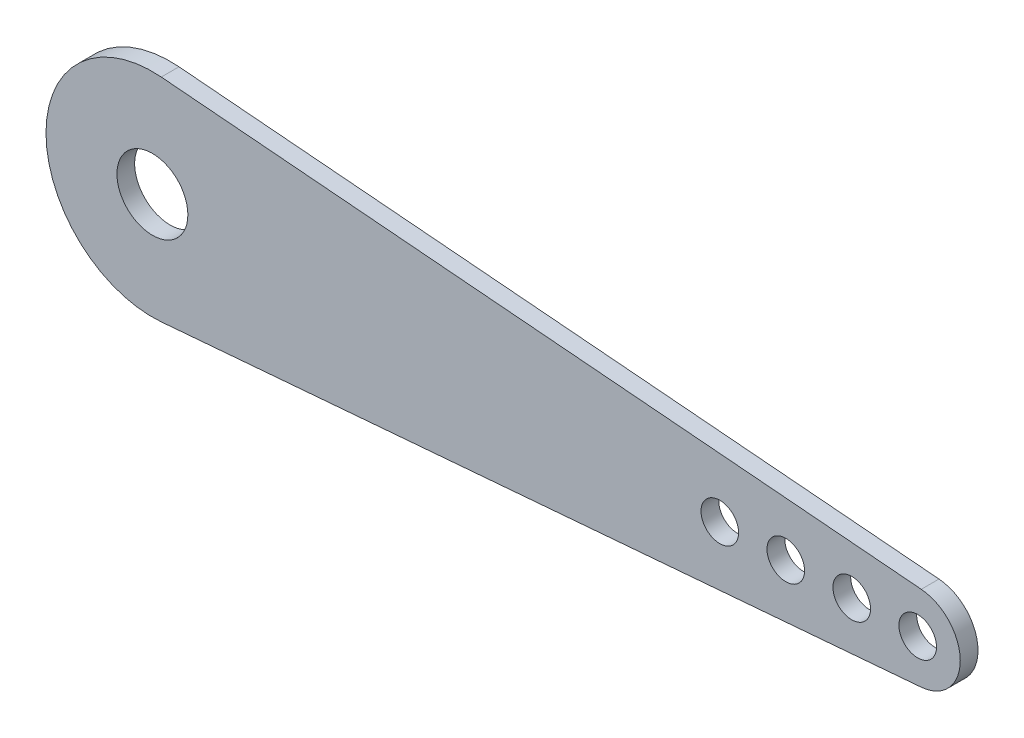
ISO-10303-21;
HEADER;
FILE_DESCRIPTION(('STEP AP214'),'2;1');
FILE_NAME('part.step','',(''),(''),'','','');
FILE_SCHEMA(('AUTOMOTIVE_DESIGN { 1 0 10303 214 1 1 1 1 }'));
ENDSEC;
DATA;
#1=APPLICATION_CONTEXT('core data for automotive mechanical design processes');
#2=APPLICATION_PROTOCOL_DEFINITION('international standard','automotive_design',2000,#1);
#3=PRODUCT_CONTEXT('',#1,'mechanical');
#4=PRODUCT('Part','Part','',(#3));
#5=PRODUCT_RELATED_PRODUCT_CATEGORY('part','',(#4));
#6=PRODUCT_DEFINITION_FORMATION('','',#4);
#7=PRODUCT_DEFINITION_CONTEXT('part definition',#1,'design');
#8=PRODUCT_DEFINITION('design','',#6,#7);
#9=PRODUCT_DEFINITION_SHAPE('','',#8);
#10=(LENGTH_UNIT() NAMED_UNIT(*) SI_UNIT(.MILLI.,.METRE.));
#11=(NAMED_UNIT(*) PLANE_ANGLE_UNIT() SI_UNIT($,.RADIAN.));
#12=(NAMED_UNIT(*) SI_UNIT($,.STERADIAN.) SOLID_ANGLE_UNIT());
#13=UNCERTAINTY_MEASURE_WITH_UNIT(LENGTH_MEASURE(1.E-05),#10,'distance_accuracy_value','');
#14=(GEOMETRIC_REPRESENTATION_CONTEXT(3) GLOBAL_UNCERTAINTY_ASSIGNED_CONTEXT((#13)) GLOBAL_UNIT_ASSIGNED_CONTEXT((#10,
#11,#12)) REPRESENTATION_CONTEXT('',''));
#15=CARTESIAN_POINT('',(0.,0.,0.));
#16=DIRECTION('',(0.,0.,1.));
#17=DIRECTION('',(1.,0.,0.));
#18=AXIS2_PLACEMENT_3D('',#15,#16,#17);
#19=CARTESIAN_POINT('',(0.,0.,3.175));
#20=DIRECTION('',(0.,0.,-1.));
#21=DIRECTION('',(-1.,0.,0.));
#22=AXIS2_PLACEMENT_3D('',#19,#20,#21);
#23=CYLINDRICAL_SURFACE('',#22,19.05);
#24=CARTESIAN_POINT('',(0.,0.,0.));
#25=DIRECTION('',(0.,0.,1.));
#26=DIRECTION('',(1.,0.,0.));
#27=AXIS2_PLACEMENT_3D('',#24,#25,#26);
#28=CIRCLE('',#27,19.05);
#29=CARTESIAN_POINT('',(1.58897126969416,18.9836158385089,0.));
#30=VERTEX_POINT('',#29);
#31=CARTESIAN_POINT('',(1.58897126969416,-18.9836158385089,0.));
#32=VERTEX_POINT('',#31);
#33=EDGE_CURVE('E112',#30,#32,#28,.T.);
#34=ORIENTED_EDGE('',*,*,#33,.T.);
#35=DIRECTION('',(0.,0.,-1.));
#36=VECTOR('',#35,1.);
#37=CARTESIAN_POINT('',(1.58897126969416,-18.9836158385089,3.175));
#38=LINE('',#37,#36);
#39=CARTESIAN_POINT('',(1.58897126969416,-18.9836158385089,3.175));
#40=VERTEX_POINT('',#39);
#41=EDGE_CURVE('E11',#40,#32,#38,.T.);
#42=ORIENTED_EDGE('',*,*,#41,.F.);
#43=CARTESIAN_POINT('',(0.,0.,3.175));
#44=DIRECTION('',(0.,0.,1.));
#45=DIRECTION('',(1.,0.,0.));
#46=AXIS2_PLACEMENT_3D('',#43,#44,#45);
#47=CIRCLE('',#46,19.05);
#48=CARTESIAN_POINT('',(1.58897126969416,18.9836158385089,3.175));
#49=VERTEX_POINT('',#48);
#50=EDGE_CURVE('E95',#49,#40,#47,.T.);
#51=ORIENTED_EDGE('',*,*,#50,.F.);
#52=DIRECTION('',(0.,0.,-1.));
#53=VECTOR('',#52,1.);
#54=CARTESIAN_POINT('',(1.58897126969416,18.9836158385089,3.175));
#55=LINE('',#54,#53);
#56=EDGE_CURVE('E62',#49,#30,#55,.T.);
#57=ORIENTED_EDGE('',*,*,#56,.T.);
#58=EDGE_LOOP('',(#34,#42,#51,#57));
#59=FACE_BOUND('',#58,.T.);
#60=ADVANCED_FACE('F45',(#59),#23,.T.);
#61=CARTESIAN_POINT('',(1.58897126969416,-18.9836158385089,3.175));
#62=DIRECTION('',(-0.0834105653382762,0.996515267113329,0.));
#63=DIRECTION('',(-0.996515267113329,-0.0834105653382762,0.));
#64=AXIS2_PLACEMENT_3D('',#61,#62,#63);
#65=PLANE('',#64);
#66=DIRECTION('',(0.996515267113329,0.0834105653382762,0.));
#67=VECTOR('',#66,1.);
#68=CARTESIAN_POINT('',(1.58897126969416,-18.9836158385089,0.));
#69=LINE('',#68,#67);
#70=CARTESIAN_POINT('',(137.668588507878,-7.59344633540356,0.));
#71=VERTEX_POINT('',#70);
#72=EDGE_CURVE('E100',#32,#71,#69,.T.);
#73=ORIENTED_EDGE('',*,*,#72,.T.);
#74=DIRECTION('',(0.,0.,-1.));
#75=VECTOR('',#74,1.);
#76=CARTESIAN_POINT('',(137.668588507878,-7.59344633540356,3.175));
#77=LINE('',#76,#75);
#78=CARTESIAN_POINT('',(137.668588507878,-7.59344633540356,3.175));
#79=VERTEX_POINT('',#78);
#80=EDGE_CURVE('E54',#79,#71,#77,.T.);
#81=ORIENTED_EDGE('',*,*,#80,.F.);
#82=DIRECTION('',(0.996515267113329,0.0834105653382762,0.));
#83=VECTOR('',#82,1.);
#84=CARTESIAN_POINT('',(1.58897126969416,-18.9836158385089,3.175));
#85=LINE('',#84,#83);
#86=EDGE_CURVE('E88',#40,#79,#85,.T.);
#87=ORIENTED_EDGE('',*,*,#86,.F.);
#88=ORIENTED_EDGE('',*,*,#41,.T.);
#89=EDGE_LOOP('',(#73,#81,#87,#88));
#90=FACE_BOUND('',#89,.T.);
#91=ADVANCED_FACE('F99',(#90),#65,.F.);
#92=CARTESIAN_POINT('',(137.033,0.,3.175));
#93=DIRECTION('',(0.,0.,-1.));
#94=DIRECTION('',(-1.,0.,0.));
#95=AXIS2_PLACEMENT_3D('',#92,#93,#94);
#96=CYLINDRICAL_SURFACE('',#95,7.62);
#97=CARTESIAN_POINT('',(137.033,0.,0.));
#98=DIRECTION('',(0.,0.,1.));
#99=DIRECTION('',(1.,0.,0.));
#100=AXIS2_PLACEMENT_3D('',#97,#98,#99);
#101=CIRCLE('',#100,7.62);
#102=CARTESIAN_POINT('',(137.668588507878,7.59344633540356,0.));
#103=VERTEX_POINT('',#102);
#104=EDGE_CURVE('E116',#71,#103,#101,.T.);
#105=ORIENTED_EDGE('',*,*,#104,.T.);
#106=DIRECTION('',(0.,0.,-1.));
#107=VECTOR('',#106,1.);
#108=CARTESIAN_POINT('',(137.668588507878,7.59344633540356,3.175));
#109=LINE('',#108,#107);
#110=CARTESIAN_POINT('',(137.668588507878,7.59344633540356,3.175));
#111=VERTEX_POINT('',#110);
#112=EDGE_CURVE('E77',#111,#103,#109,.T.);
#113=ORIENTED_EDGE('',*,*,#112,.F.);
#114=CARTESIAN_POINT('',(137.033,0.,3.175));
#115=DIRECTION('',(0.,0.,1.));
#116=DIRECTION('',(1.,0.,0.));
#117=AXIS2_PLACEMENT_3D('',#114,#115,#116);
#118=CIRCLE('',#117,7.62);
#119=EDGE_CURVE('E94',#79,#111,#118,.T.);
#120=ORIENTED_EDGE('',*,*,#119,.F.);
#121=ORIENTED_EDGE('',*,*,#80,.T.);
#122=EDGE_LOOP('',(#105,#113,#120,#121));
#123=FACE_BOUND('',#122,.T.);
#124=ADVANCED_FACE('F103',(#123),#96,.T.);
#125=CARTESIAN_POINT('',(0.,0.,3.175));
#126=DIRECTION('',(0.,0.,-1.));
#127=DIRECTION('',(-1.,0.,0.));
#128=AXIS2_PLACEMENT_3D('',#125,#126,#127);
#129=CYLINDRICAL_SURFACE('',#128,6.35);
#130=CARTESIAN_POINT('',(0.,0.,3.175));
#131=DIRECTION('',(0.,0.,1.));
#132=DIRECTION('',(1.,0.,0.));
#133=AXIS2_PLACEMENT_3D('',#130,#131,#132);
#134=CIRCLE('',#133,6.35);
#135=CARTESIAN_POINT('',(6.35,0.,3.175));
#136=VERTEX_POINT('',#135);
#137=EDGE_CURVE('E121',#136,#136,#134,.T.);
#138=ORIENTED_EDGE('',*,*,#137,.T.);
#139=EDGE_LOOP('',(#138));
#140=FACE_BOUND('',#139,.T.);
#141=CARTESIAN_POINT('',(0.,0.,0.));
#142=DIRECTION('',(0.,0.,1.));
#143=DIRECTION('',(1.,0.,0.));
#144=AXIS2_PLACEMENT_3D('',#141,#142,#143);
#145=CIRCLE('',#144,6.35);
#146=CARTESIAN_POINT('',(6.35,0.,0.));
#147=VERTEX_POINT('',#146);
#148=EDGE_CURVE('E109',#147,#147,#145,.T.);
#149=ORIENTED_EDGE('',*,*,#148,.F.);
#150=EDGE_LOOP('',(#149));
#151=FACE_BOUND('',#150,.T.);
#152=ADVANCED_FACE('F47',(#140,#151),#129,.F.);
#153=CARTESIAN_POINT('',(1.58897126969416,18.9836158385089,3.175));
#154=DIRECTION('',(0.0834105653382762,0.996515267113329,0.));
#155=DIRECTION('',(-0.996515267113329,0.0834105653382762,0.));
#156=AXIS2_PLACEMENT_3D('',#153,#154,#155);
#157=PLANE('',#156);
#158=DIRECTION('',(0.996515267113329,-0.0834105653382762,0.));
#159=VECTOR('',#158,1.);
#160=CARTESIAN_POINT('',(1.58897126969416,18.9836158385089,0.));
#161=LINE('',#160,#159);
#162=EDGE_CURVE('E118',#30,#103,#161,.T.);
#163=ORIENTED_EDGE('',*,*,#162,.F.);
#164=ORIENTED_EDGE('',*,*,#56,.F.);
#165=DIRECTION('',(0.996515267113329,-0.0834105653382762,0.));
#166=VECTOR('',#165,1.);
#167=CARTESIAN_POINT('',(1.58897126969416,18.9836158385089,3.175));
#168=LINE('',#167,#166);
#169=EDGE_CURVE('E104',#49,#111,#168,.T.);
#170=ORIENTED_EDGE('',*,*,#169,.T.);
#171=ORIENTED_EDGE('',*,*,#112,.T.);
#172=EDGE_LOOP('',(#163,#164,#170,#171));
#173=FACE_BOUND('',#172,.T.);
#174=ADVANCED_FACE('F165',(#173),#157,.T.);
#175=CARTESIAN_POINT('',(0.,0.,3.175));
#176=DIRECTION('',(0.,0.,1.));
#177=DIRECTION('',(1.,0.,0.));
#178=AXIS2_PLACEMENT_3D('',#175,#176,#177);
#179=PLANE('',#178);
#180=CARTESIAN_POINT('',(101.6,0.,3.175));
#181=DIRECTION('',(0.,0.,1.));
#182=DIRECTION('',(1.,0.,0.));
#183=AXIS2_PLACEMENT_3D('',#180,#181,#182);
#184=CIRCLE('',#183,3.36549999999999);
#185=CARTESIAN_POINT('',(104.9655,0.,3.175));
#186=VERTEX_POINT('',#185);
#187=EDGE_CURVE('E113',#186,#186,#184,.T.);
#188=ORIENTED_EDGE('',*,*,#187,.F.);
#189=EDGE_LOOP('',(#188));
#190=FACE_BOUND('',#189,.T.);
#191=CARTESIAN_POINT('',(113.411,0.,3.175));
#192=DIRECTION('',(0.,0.,1.));
#193=DIRECTION('',(1.,0.,0.));
#194=AXIS2_PLACEMENT_3D('',#191,#192,#193);
#195=CIRCLE('',#194,3.36549999999999);
#196=CARTESIAN_POINT('',(116.7765,0.,3.175));
#197=VERTEX_POINT('',#196);
#198=EDGE_CURVE('E142',#197,#197,#195,.T.);
#199=ORIENTED_EDGE('',*,*,#198,.F.);
#200=EDGE_LOOP('',(#199));
#201=FACE_BOUND('',#200,.T.);
#202=CARTESIAN_POINT('',(125.222,0.,3.175));
#203=DIRECTION('',(0.,0.,1.));
#204=DIRECTION('',(1.,0.,0.));
#205=AXIS2_PLACEMENT_3D('',#202,#203,#204);
#206=CIRCLE('',#205,3.36549999999999);
#207=CARTESIAN_POINT('',(128.5875,0.,3.175));
#208=VERTEX_POINT('',#207);
#209=EDGE_CURVE('E136',#208,#208,#206,.T.);
#210=ORIENTED_EDGE('',*,*,#209,.F.);
#211=EDGE_LOOP('',(#210));
#212=FACE_BOUND('',#211,.T.);
#213=CARTESIAN_POINT('',(137.033,0.,3.175));
#214=DIRECTION('',(0.,0.,1.));
#215=DIRECTION('',(1.,0.,0.));
#216=AXIS2_PLACEMENT_3D('',#213,#214,#215);
#217=CIRCLE('',#216,3.36549999999999);
#218=CARTESIAN_POINT('',(140.3985,0.,3.175));
#219=VERTEX_POINT('',#218);
#220=EDGE_CURVE('E129',#219,#219,#217,.T.);
#221=ORIENTED_EDGE('',*,*,#220,.F.);
#222=EDGE_LOOP('',(#221));
#223=FACE_BOUND('',#222,.T.);
#224=ORIENTED_EDGE('',*,*,#137,.F.);
#225=EDGE_LOOP('',(#224));
#226=FACE_BOUND('',#225,.T.);
#227=ORIENTED_EDGE('',*,*,#50,.T.);
#228=ORIENTED_EDGE('',*,*,#86,.T.);
#229=ORIENTED_EDGE('',*,*,#119,.T.);
#230=ORIENTED_EDGE('',*,*,#169,.F.);
#231=EDGE_LOOP('',(#227,#228,#229,#230));
#232=FACE_BOUND('',#231,.T.);
#233=ADVANCED_FACE('F91',(#190,#201,#212,#223,#226,#232),#179,.T.);
#234=CARTESIAN_POINT('',(0.,0.,0.));
#235=DIRECTION('',(0.,0.,1.));
#236=DIRECTION('',(1.,0.,0.));
#237=AXIS2_PLACEMENT_3D('',#234,#235,#236);
#238=PLANE('',#237);
#239=CARTESIAN_POINT('',(101.6,0.,0.));
#240=DIRECTION('',(0.,0.,1.));
#241=DIRECTION('',(1.,0.,0.));
#242=AXIS2_PLACEMENT_3D('',#239,#240,#241);
#243=CIRCLE('',#242,3.36549999999999);
#244=CARTESIAN_POINT('',(104.9655,0.,0.));
#245=VERTEX_POINT('',#244);
#246=EDGE_CURVE('E145',#245,#245,#243,.T.);
#247=ORIENTED_EDGE('',*,*,#246,.T.);
#248=EDGE_LOOP('',(#247));
#249=FACE_BOUND('',#248,.T.);
#250=CARTESIAN_POINT('',(113.411,0.,0.));
#251=DIRECTION('',(0.,0.,1.));
#252=DIRECTION('',(1.,0.,0.));
#253=AXIS2_PLACEMENT_3D('',#250,#251,#252);
#254=CIRCLE('',#253,3.36549999999999);
#255=CARTESIAN_POINT('',(116.7765,0.,0.));
#256=VERTEX_POINT('',#255);
#257=EDGE_CURVE('E139',#256,#256,#254,.T.);
#258=ORIENTED_EDGE('',*,*,#257,.T.);
#259=EDGE_LOOP('',(#258));
#260=FACE_BOUND('',#259,.T.);
#261=CARTESIAN_POINT('',(125.222,0.,0.));
#262=DIRECTION('',(0.,0.,1.));
#263=DIRECTION('',(1.,0.,0.));
#264=AXIS2_PLACEMENT_3D('',#261,#262,#263);
#265=CIRCLE('',#264,3.36549999999999);
#266=CARTESIAN_POINT('',(128.5875,0.,0.));
#267=VERTEX_POINT('',#266);
#268=EDGE_CURVE('E132',#267,#267,#265,.T.);
#269=ORIENTED_EDGE('',*,*,#268,.T.);
#270=EDGE_LOOP('',(#269));
#271=FACE_BOUND('',#270,.T.);
#272=CARTESIAN_POINT('',(137.033,0.,0.));
#273=DIRECTION('',(0.,0.,1.));
#274=DIRECTION('',(1.,0.,0.));
#275=AXIS2_PLACEMENT_3D('',#272,#273,#274);
#276=CIRCLE('',#275,3.36549999999999);
#277=CARTESIAN_POINT('',(140.3985,0.,0.));
#278=VERTEX_POINT('',#277);
#279=EDGE_CURVE('E133',#278,#278,#276,.T.);
#280=ORIENTED_EDGE('',*,*,#279,.T.);
#281=EDGE_LOOP('',(#280));
#282=FACE_BOUND('',#281,.T.);
#283=ORIENTED_EDGE('',*,*,#148,.T.);
#284=EDGE_LOOP('',(#283));
#285=FACE_BOUND('',#284,.T.);
#286=ORIENTED_EDGE('',*,*,#33,.F.);
#287=ORIENTED_EDGE('',*,*,#162,.T.);
#288=ORIENTED_EDGE('',*,*,#104,.F.);
#289=ORIENTED_EDGE('',*,*,#72,.F.);
#290=EDGE_LOOP('',(#286,#287,#288,#289));
#291=FACE_BOUND('',#290,.T.);
#292=ADVANCED_FACE('F153',(#249,#260,#271,#282,#285,#291),#238,.F.);
#293=CARTESIAN_POINT('',(137.033,0.,12.6940714883333));
#294=DIRECTION('',(0.,0.,-1.));
#295=DIRECTION('',(-1.,0.,0.));
#296=AXIS2_PLACEMENT_3D('',#293,#294,#295);
#297=CYLINDRICAL_SURFACE('',#296,3.36549999999999);
#298=ORIENTED_EDGE('',*,*,#279,.F.);
#299=EDGE_LOOP('',(#298));
#300=FACE_BOUND('',#299,.T.);
#301=ORIENTED_EDGE('',*,*,#220,.T.);
#302=EDGE_LOOP('',(#301));
#303=FACE_BOUND('',#302,.T.);
#304=ADVANCED_FACE('F174',(#300,#303),#297,.F.);
#305=CARTESIAN_POINT('',(125.222,0.,12.6940714883333));
#306=DIRECTION('',(0.,0.,-1.));
#307=DIRECTION('',(-1.,0.,0.));
#308=AXIS2_PLACEMENT_3D('',#305,#306,#307);
#309=CYLINDRICAL_SURFACE('',#308,3.36549999999999);
#310=ORIENTED_EDGE('',*,*,#268,.F.);
#311=EDGE_LOOP('',(#310));
#312=FACE_BOUND('',#311,.T.);
#313=ORIENTED_EDGE('',*,*,#209,.T.);
#314=EDGE_LOOP('',(#313));
#315=FACE_BOUND('',#314,.T.);
#316=ADVANCED_FACE('F176',(#312,#315),#309,.F.);
#317=CARTESIAN_POINT('',(113.411,0.,12.6940714883333));
#318=DIRECTION('',(0.,0.,-1.));
#319=DIRECTION('',(-1.,0.,0.));
#320=AXIS2_PLACEMENT_3D('',#317,#318,#319);
#321=CYLINDRICAL_SURFACE('',#320,3.36549999999999);
#322=ORIENTED_EDGE('',*,*,#257,.F.);
#323=EDGE_LOOP('',(#322));
#324=FACE_BOUND('',#323,.T.);
#325=ORIENTED_EDGE('',*,*,#198,.T.);
#326=EDGE_LOOP('',(#325));
#327=FACE_BOUND('',#326,.T.);
#328=ADVANCED_FACE('F159',(#324,#327),#321,.F.);
#329=CARTESIAN_POINT('',(101.6,0.,12.6940714883333));
#330=DIRECTION('',(0.,0.,-1.));
#331=DIRECTION('',(-1.,0.,0.));
#332=AXIS2_PLACEMENT_3D('',#329,#330,#331);
#333=CYLINDRICAL_SURFACE('',#332,3.36549999999999);
#334=ORIENTED_EDGE('',*,*,#246,.F.);
#335=EDGE_LOOP('',(#334));
#336=FACE_BOUND('',#335,.T.);
#337=ORIENTED_EDGE('',*,*,#187,.T.);
#338=EDGE_LOOP('',(#337));
#339=FACE_BOUND('',#338,.T.);
#340=ADVANCED_FACE('F156',(#336,#339),#333,.F.);
#341=CLOSED_SHELL('',(#60,#91,#124,#152,#174,#233,#292,#304,#316,#328,#340));
#342=MANIFOLD_SOLID_BREP('B2',#341);
#343=ADVANCED_BREP_SHAPE_REPRESENTATION('',(#18,#342),#14);
#344=SHAPE_DEFINITION_REPRESENTATION(#9,#343);
ENDSEC;
END-ISO-10303-21;
